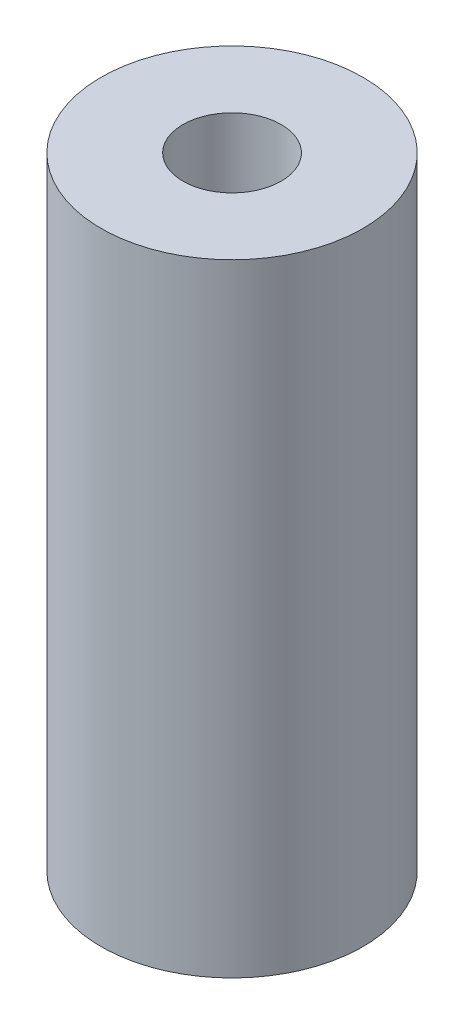
ISO-10303-21;
HEADER;
FILE_DESCRIPTION(('STEP AP214'),'2;1');
FILE_NAME('part.step','',(''),(''),'','','');
FILE_SCHEMA(('AUTOMOTIVE_DESIGN { 1 0 10303 214 1 1 1 1 }'));
ENDSEC;
DATA;
#1=APPLICATION_CONTEXT('core data for automotive mechanical design processes');
#2=APPLICATION_PROTOCOL_DEFINITION('international standard','automotive_design',2000,#1);
#3=PRODUCT_CONTEXT('',#1,'mechanical');
#4=PRODUCT('Part','Part','',(#3));
#5=PRODUCT_RELATED_PRODUCT_CATEGORY('part','',(#4));
#6=PRODUCT_DEFINITION_FORMATION('','',#4);
#7=PRODUCT_DEFINITION_CONTEXT('part definition',#1,'design');
#8=PRODUCT_DEFINITION('design','',#6,#7);
#9=PRODUCT_DEFINITION_SHAPE('','',#8);
#10=(LENGTH_UNIT() NAMED_UNIT(*) SI_UNIT(.MILLI.,.METRE.));
#11=(NAMED_UNIT(*) PLANE_ANGLE_UNIT() SI_UNIT($,.RADIAN.));
#12=(NAMED_UNIT(*) SI_UNIT($,.STERADIAN.) SOLID_ANGLE_UNIT());
#13=UNCERTAINTY_MEASURE_WITH_UNIT(LENGTH_MEASURE(1.E-05),#10,'distance_accuracy_value','');
#14=(GEOMETRIC_REPRESENTATION_CONTEXT(3) GLOBAL_UNCERTAINTY_ASSIGNED_CONTEXT((#13)) GLOBAL_UNIT_ASSIGNED_CONTEXT((#10,
#11,#12)) REPRESENTATION_CONTEXT('',''));
#15=CARTESIAN_POINT('',(0.,0.,0.));
#16=DIRECTION('',(0.,0.,1.));
#17=DIRECTION('',(1.,0.,0.));
#18=AXIS2_PLACEMENT_3D('',#15,#16,#17);
#19=CARTESIAN_POINT('',(0.,120.65,0.));
#20=DIRECTION('',(0.,1.,0.));
#21=DIRECTION('',(0.,0.,1.));
#22=AXIS2_PLACEMENT_3D('',#19,#20,#21);
#23=PLANE('',#22);
#24=CARTESIAN_POINT('',(0.,120.65,0.));
#25=DIRECTION('',(0.,1.,0.));
#26=DIRECTION('',(0.,0.,1.));
#27=AXIS2_PLACEMENT_3D('',#24,#25,#26);
#28=CIRCLE('',#27,25.4);
#29=CARTESIAN_POINT('',(0.,120.65,-25.4));
#30=VERTEX_POINT('',#29);
#31=EDGE_CURVE('E10',#30,#30,#28,.T.);
#32=ORIENTED_EDGE('',*,*,#31,.T.);
#33=EDGE_LOOP('',(#32));
#34=FACE_BOUND('',#33,.T.);
#35=CARTESIAN_POINT('',(0.,120.65,0.));
#36=DIRECTION('',(0.,1.,0.));
#37=DIRECTION('',(0.,0.,1.));
#38=AXIS2_PLACEMENT_3D('',#35,#36,#37);
#39=CIRCLE('',#38,9.525);
#40=CARTESIAN_POINT('',(0.,120.65,-9.525));
#41=VERTEX_POINT('',#40);
#42=EDGE_CURVE('E55',#41,#41,#39,.T.);
#43=ORIENTED_EDGE('',*,*,#42,.F.);
#44=EDGE_LOOP('',(#43));
#45=FACE_BOUND('',#44,.T.);
#46=ADVANCED_FACE('F41',(#34,#45),#23,.T.);
#47=CARTESIAN_POINT('',(0.,0.,0.));
#48=DIRECTION('',(0.,1.,0.));
#49=DIRECTION('',(0.,0.,1.));
#50=AXIS2_PLACEMENT_3D('',#47,#48,#49);
#51=PLANE('',#50);
#52=CARTESIAN_POINT('',(0.,0.,0.));
#53=DIRECTION('',(0.,1.,0.));
#54=DIRECTION('',(0.,0.,1.));
#55=AXIS2_PLACEMENT_3D('',#52,#53,#54);
#56=CIRCLE('',#55,25.4);
#57=CARTESIAN_POINT('',(0.,0.,-25.4));
#58=VERTEX_POINT('',#57);
#59=EDGE_CURVE('E45',#58,#58,#56,.T.);
#60=ORIENTED_EDGE('',*,*,#59,.F.);
#61=EDGE_LOOP('',(#60));
#62=FACE_BOUND('',#61,.T.);
#63=CARTESIAN_POINT('',(0.,0.,0.));
#64=DIRECTION('',(0.,1.,0.));
#65=DIRECTION('',(0.,0.,1.));
#66=AXIS2_PLACEMENT_3D('',#63,#64,#65);
#67=CIRCLE('',#66,9.525);
#68=CARTESIAN_POINT('',(0.,0.,-9.525));
#69=VERTEX_POINT('',#68);
#70=EDGE_CURVE('E57',#69,#69,#67,.T.);
#71=ORIENTED_EDGE('',*,*,#70,.T.);
#72=EDGE_LOOP('',(#71));
#73=FACE_BOUND('',#72,.T.);
#74=ADVANCED_FACE('F70',(#62,#73),#51,.F.);
#75=CARTESIAN_POINT('',(0.,120.65,0.));
#76=DIRECTION('',(0.,-1.,0.));
#77=DIRECTION('',(0.,0.,-1.));
#78=AXIS2_PLACEMENT_3D('',#75,#76,#77);
#79=CYLINDRICAL_SURFACE('',#78,25.4);
#80=CARTESIAN_POINT('',(0.,120.65,-25.4));
#81=CARTESIAN_POINT('',(0.,119.393229166667,-25.4));
#82=CARTESIAN_POINT('',(0.,118.136458333333,-25.4));
#83=CARTESIAN_POINT('',(0.,115.622916666667,-25.4));
#84=CARTESIAN_POINT('',(0.,114.366145833333,-25.4));
#85=CARTESIAN_POINT('',(0.,111.852604166667,-25.4));
#86=CARTESIAN_POINT('',(0.,110.595833333333,-25.4));
#87=CARTESIAN_POINT('',(0.,108.082291666667,-25.4));
#88=CARTESIAN_POINT('',(0.,106.825520833333,-25.4));
#89=CARTESIAN_POINT('',(0.,104.311979166667,-25.4));
#90=CARTESIAN_POINT('',(0.,103.055208333333,-25.4));
#91=CARTESIAN_POINT('',(0.,100.541666666667,-25.4));
#92=CARTESIAN_POINT('',(0.,99.2848958333333,-25.4));
#93=CARTESIAN_POINT('',(0.,96.7713541666667,-25.4));
#94=CARTESIAN_POINT('',(0.,95.5145833333333,-25.4));
#95=CARTESIAN_POINT('',(0.,93.0010416666667,-25.4));
#96=CARTESIAN_POINT('',(0.,91.7442708333333,-25.4));
#97=CARTESIAN_POINT('',(0.,89.2307291666666,-25.4));
#98=CARTESIAN_POINT('',(0.,87.9739583333333,-25.4));
#99=CARTESIAN_POINT('',(0.,85.4604166666666,-25.4));
#100=CARTESIAN_POINT('',(0.,84.2036458333333,-25.4));
#101=CARTESIAN_POINT('',(0.,81.6901041666667,-25.4));
#102=CARTESIAN_POINT('',(0.,80.4333333333333,-25.4));
#103=CARTESIAN_POINT('',(0.,77.9197916666667,-25.4));
#104=CARTESIAN_POINT('',(0.,76.6630208333333,-25.4));
#105=CARTESIAN_POINT('',(0.,74.1494791666667,-25.4));
#106=CARTESIAN_POINT('',(0.,72.8927083333333,-25.4));
#107=CARTESIAN_POINT('',(0.,70.3791666666667,-25.4));
#108=CARTESIAN_POINT('',(0.,69.1223958333333,-25.4));
#109=CARTESIAN_POINT('',(0.,66.6088541666666,-25.4));
#110=CARTESIAN_POINT('',(0.,65.3520833333333,-25.4));
#111=CARTESIAN_POINT('',(0.,62.8385416666667,-25.4));
#112=CARTESIAN_POINT('',(0.,61.5817708333333,-25.4));
#113=CARTESIAN_POINT('',(0.,59.0682291666667,-25.4));
#114=CARTESIAN_POINT('',(0.,57.8114583333333,-25.4));
#115=CARTESIAN_POINT('',(0.,55.2979166666667,-25.4));
#116=CARTESIAN_POINT('',(0.,54.0411458333333,-25.4));
#117=CARTESIAN_POINT('',(0.,51.5276041666667,-25.4));
#118=CARTESIAN_POINT('',(0.,50.2708333333333,-25.4));
#119=CARTESIAN_POINT('',(0.,47.7572916666667,-25.4));
#120=CARTESIAN_POINT('',(0.,46.5005208333333,-25.4));
#121=CARTESIAN_POINT('',(0.,43.9869791666667,-25.4));
#122=CARTESIAN_POINT('',(0.,42.7302083333333,-25.4));
#123=CARTESIAN_POINT('',(0.,40.2166666666667,-25.4));
#124=CARTESIAN_POINT('',(0.,38.9598958333333,-25.4));
#125=CARTESIAN_POINT('',(0.,36.4463541666667,-25.4));
#126=CARTESIAN_POINT('',(0.,35.1895833333333,-25.4));
#127=CARTESIAN_POINT('',(0.,32.6760416666667,-25.4));
#128=CARTESIAN_POINT('',(0.,31.4192708333333,-25.4));
#129=CARTESIAN_POINT('',(0.,28.9057291666667,-25.4));
#130=CARTESIAN_POINT('',(0.,27.6489583333333,-25.4));
#131=CARTESIAN_POINT('',(0.,25.1354166666667,-25.4));
#132=CARTESIAN_POINT('',(0.,23.8786458333333,-25.4));
#133=CARTESIAN_POINT('',(0.,21.3651041666667,-25.4));
#134=CARTESIAN_POINT('',(0.,20.1083333333333,-25.4));
#135=CARTESIAN_POINT('',(0.,17.5947916666667,-25.4));
#136=CARTESIAN_POINT('',(0.,16.3380208333333,-25.4));
#137=CARTESIAN_POINT('',(0.,13.8244791666667,-25.4));
#138=CARTESIAN_POINT('',(0.,12.5677083333333,-25.4));
#139=CARTESIAN_POINT('',(0.,10.0541666666667,-25.4));
#140=CARTESIAN_POINT('',(0.,8.79739583333333,-25.4));
#141=CARTESIAN_POINT('',(0.,6.28385416666666,-25.4));
#142=CARTESIAN_POINT('',(0.,5.02708333333333,-25.4));
#143=CARTESIAN_POINT('',(0.,2.51354166666666,-25.4));
#144=CARTESIAN_POINT('',(0.,1.25677083333333,-25.4));
#145=CARTESIAN_POINT('',(0.,0.,-25.4));
#146=B_SPLINE_CURVE_WITH_KNOTS('',3,(#80,#81,#82,#83,#84,#85,#86,#87,#88,#89,#90,#91,#92,#93,
#94,#95,#96,#97,#98,#99,#100,#101,#102,#103,#104,#105,#106,#107,#108,#109,#110,#111,#112,#113,
#114,#115,#116,#117,#118,#119,#120,#121,#122,#123,#124,#125,#126,#127,#128,#129,#130,#131,#132,
#133,#134,#135,#136,#137,#138,#139,#140,#141,#142,#143,#144,#145),.UNSPECIFIED.,.F.,.F.,(4,2,2,
2,2,2,2,2,2,2,2,2,2,2,2,2,2,2,2,2,2,2,2,2,2,2,2,2,2,2,2,2,4),(0.,3.77031250000001,
7.54062500000001,11.3109375,15.08125,18.8515625,22.621875,26.3921875,30.1625,33.9328125,
37.703125,41.4734375,45.24375,49.0140625,52.784375,56.5546875,60.325,64.0953125,67.865625,
71.6359375,75.40625,79.1765625,82.946875,86.7171875,90.4875,94.2578125,98.028125,101.7984375,
105.56875,109.3390625,113.109375,116.8796875,120.65),.UNSPECIFIED.);
#147=EDGE_CURVE('BSEAM43',#30,#58,#146,.T.);
#148=ORIENTED_EDGE('',*,*,#31,.F.);
#149=ORIENTED_EDGE('',*,*,#59,.T.);
#150=ORIENTED_EDGE('',*,*,#147,.T.);
#151=ORIENTED_EDGE('',*,*,#147,.F.);
#152=EDGE_LOOP('',(#148,#150,#149,#151));
#153=FACE_BOUND('',#152,.T.);
#154=ADVANCED_FACE('F43',(#153),#79,.T.);
#155=CARTESIAN_POINT('',(0.,120.65,0.));
#156=DIRECTION('',(0.,-1.,0.));
#157=DIRECTION('',(0.,0.,-1.));
#158=AXIS2_PLACEMENT_3D('',#155,#156,#157);
#159=CYLINDRICAL_SURFACE('',#158,9.525);
#160=CARTESIAN_POINT('',(0.,120.65,-9.525));
#161=CARTESIAN_POINT('',(0.,119.393229166667,-9.525));
#162=CARTESIAN_POINT('',(0.,118.136458333333,-9.525));
#163=CARTESIAN_POINT('',(0.,115.622916666667,-9.525));
#164=CARTESIAN_POINT('',(0.,114.366145833333,-9.525));
#165=CARTESIAN_POINT('',(0.,111.852604166667,-9.525));
#166=CARTESIAN_POINT('',(0.,110.595833333333,-9.525));
#167=CARTESIAN_POINT('',(0.,108.082291666667,-9.525));
#168=CARTESIAN_POINT('',(0.,106.825520833333,-9.525));
#169=CARTESIAN_POINT('',(0.,104.311979166667,-9.525));
#170=CARTESIAN_POINT('',(0.,103.055208333333,-9.525));
#171=CARTESIAN_POINT('',(0.,100.541666666667,-9.525));
#172=CARTESIAN_POINT('',(0.,99.2848958333333,-9.525));
#173=CARTESIAN_POINT('',(0.,96.7713541666667,-9.525));
#174=CARTESIAN_POINT('',(0.,95.5145833333333,-9.525));
#175=CARTESIAN_POINT('',(0.,93.0010416666667,-9.525));
#176=CARTESIAN_POINT('',(0.,91.7442708333333,-9.525));
#177=CARTESIAN_POINT('',(0.,89.2307291666666,-9.525));
#178=CARTESIAN_POINT('',(0.,87.9739583333333,-9.525));
#179=CARTESIAN_POINT('',(0.,85.4604166666666,-9.525));
#180=CARTESIAN_POINT('',(0.,84.2036458333333,-9.525));
#181=CARTESIAN_POINT('',(0.,81.6901041666667,-9.525));
#182=CARTESIAN_POINT('',(0.,80.4333333333333,-9.525));
#183=CARTESIAN_POINT('',(0.,77.9197916666667,-9.525));
#184=CARTESIAN_POINT('',(0.,76.6630208333333,-9.525));
#185=CARTESIAN_POINT('',(0.,74.1494791666667,-9.525));
#186=CARTESIAN_POINT('',(0.,72.8927083333333,-9.525));
#187=CARTESIAN_POINT('',(0.,70.3791666666667,-9.525));
#188=CARTESIAN_POINT('',(0.,69.1223958333333,-9.525));
#189=CARTESIAN_POINT('',(0.,66.6088541666666,-9.525));
#190=CARTESIAN_POINT('',(0.,65.3520833333333,-9.525));
#191=CARTESIAN_POINT('',(0.,62.8385416666667,-9.525));
#192=CARTESIAN_POINT('',(0.,61.5817708333333,-9.525));
#193=CARTESIAN_POINT('',(0.,59.0682291666667,-9.525));
#194=CARTESIAN_POINT('',(0.,57.8114583333333,-9.525));
#195=CARTESIAN_POINT('',(0.,55.2979166666667,-9.525));
#196=CARTESIAN_POINT('',(0.,54.0411458333333,-9.525));
#197=CARTESIAN_POINT('',(0.,51.5276041666667,-9.525));
#198=CARTESIAN_POINT('',(0.,50.2708333333333,-9.525));
#199=CARTESIAN_POINT('',(0.,47.7572916666667,-9.525));
#200=CARTESIAN_POINT('',(0.,46.5005208333333,-9.525));
#201=CARTESIAN_POINT('',(0.,43.9869791666667,-9.525));
#202=CARTESIAN_POINT('',(0.,42.7302083333333,-9.525));
#203=CARTESIAN_POINT('',(0.,40.2166666666667,-9.525));
#204=CARTESIAN_POINT('',(0.,38.9598958333333,-9.525));
#205=CARTESIAN_POINT('',(0.,36.4463541666667,-9.525));
#206=CARTESIAN_POINT('',(0.,35.1895833333333,-9.525));
#207=CARTESIAN_POINT('',(0.,32.6760416666667,-9.525));
#208=CARTESIAN_POINT('',(0.,31.4192708333333,-9.525));
#209=CARTESIAN_POINT('',(0.,28.9057291666667,-9.525));
#210=CARTESIAN_POINT('',(0.,27.6489583333333,-9.525));
#211=CARTESIAN_POINT('',(0.,25.1354166666667,-9.525));
#212=CARTESIAN_POINT('',(0.,23.8786458333333,-9.525));
#213=CARTESIAN_POINT('',(0.,21.3651041666667,-9.525));
#214=CARTESIAN_POINT('',(0.,20.1083333333333,-9.525));
#215=CARTESIAN_POINT('',(0.,17.5947916666667,-9.525));
#216=CARTESIAN_POINT('',(0.,16.3380208333333,-9.525));
#217=CARTESIAN_POINT('',(0.,13.8244791666667,-9.525));
#218=CARTESIAN_POINT('',(0.,12.5677083333333,-9.525));
#219=CARTESIAN_POINT('',(0.,10.0541666666667,-9.525));
#220=CARTESIAN_POINT('',(0.,8.79739583333333,-9.525));
#221=CARTESIAN_POINT('',(0.,6.28385416666666,-9.525));
#222=CARTESIAN_POINT('',(0.,5.02708333333333,-9.525));
#223=CARTESIAN_POINT('',(0.,2.51354166666666,-9.525));
#224=CARTESIAN_POINT('',(0.,1.25677083333333,-9.525));
#225=CARTESIAN_POINT('',(0.,0.,-9.525));
#226=B_SPLINE_CURVE_WITH_KNOTS('',3,(#160,#161,#162,#163,#164,#165,#166,#167,#168,#169,#170,
#171,#172,#173,#174,#175,#176,#177,#178,#179,#180,#181,#182,#183,#184,#185,#186,#187,#188,#189,
#190,#191,#192,#193,#194,#195,#196,#197,#198,#199,#200,#201,#202,#203,#204,#205,#206,#207,#208,
#209,#210,#211,#212,#213,#214,#215,#216,#217,#218,#219,#220,#221,#222,#223,#224,#225),
.UNSPECIFIED.,.F.,.F.,(4,2,2,2,2,2,2,2,2,2,2,2,2,2,2,2,2,2,2,2,2,2,2,2,2,2,2,2,2,2,2,2,4),(0.,
3.77031250000001,7.54062500000001,11.3109375,15.08125,18.8515625,22.621875,26.3921875,30.1625,
33.9328125,37.703125,41.4734375,45.24375,49.0140625,52.784375,56.5546875,60.325,64.0953125,
67.865625,71.6359375,75.40625,79.1765625,82.946875,86.7171875,90.4875,94.2578125,98.028125,
101.7984375,105.56875,109.3390625,113.109375,116.8796875,120.65),.UNSPECIFIED.);
#227=EDGE_CURVE('BSEAM66',#41,#69,#226,.T.);
#228=ORIENTED_EDGE('',*,*,#42,.T.);
#229=ORIENTED_EDGE('',*,*,#70,.F.);
#230=ORIENTED_EDGE('',*,*,#227,.T.);
#231=ORIENTED_EDGE('',*,*,#227,.F.);
#232=EDGE_LOOP('',(#228,#230,#229,#231));
#233=FACE_BOUND('',#232,.T.);
#234=ADVANCED_FACE('F66',(#233),#159,.F.);
#235=CLOSED_SHELL('',(#46,#74,#154,#234));
#236=MANIFOLD_SOLID_BREP('B2',#235);
#237=ADVANCED_BREP_SHAPE_REPRESENTATION('',(#18,#236),#14);
#238=SHAPE_DEFINITION_REPRESENTATION(#9,#237);
ENDSEC;
END-ISO-10303-21;
